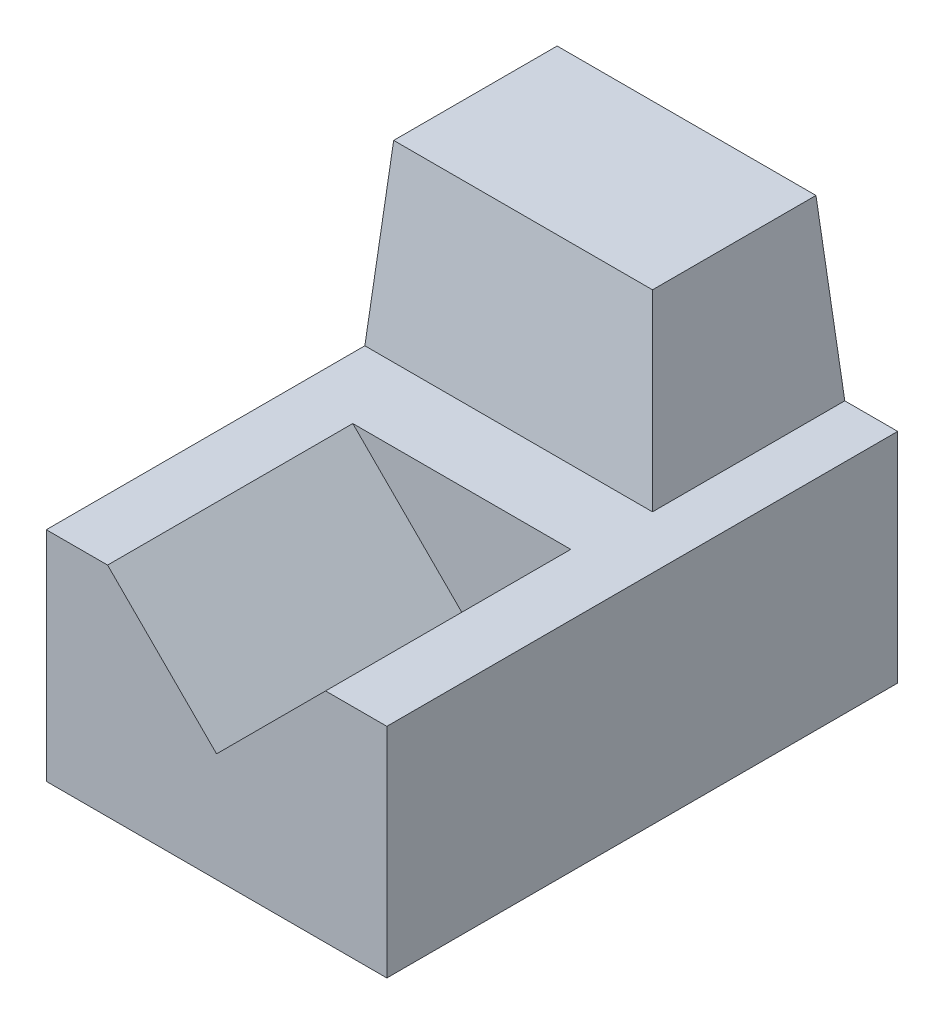
ISO-10303-21;
HEADER;
FILE_DESCRIPTION(('STEP AP214'),'2;1');
FILE_NAME('part.step','',(''),(''),'','','');
FILE_SCHEMA(('AUTOMOTIVE_DESIGN { 1 0 10303 214 1 1 1 1 }'));
ENDSEC;
DATA;
#1=APPLICATION_CONTEXT('core data for automotive mechanical design processes');
#2=APPLICATION_PROTOCOL_DEFINITION('international standard','automotive_design',2000,#1);
#3=PRODUCT_CONTEXT('',#1,'mechanical');
#4=PRODUCT('Part','Part','',(#3));
#5=PRODUCT_RELATED_PRODUCT_CATEGORY('part','',(#4));
#6=PRODUCT_DEFINITION_FORMATION('','',#4);
#7=PRODUCT_DEFINITION_CONTEXT('part definition',#1,'design');
#8=PRODUCT_DEFINITION('design','',#6,#7);
#9=PRODUCT_DEFINITION_SHAPE('','',#8);
#10=(LENGTH_UNIT() NAMED_UNIT(*) SI_UNIT(.MILLI.,.METRE.));
#11=(NAMED_UNIT(*) PLANE_ANGLE_UNIT() SI_UNIT($,.RADIAN.));
#12=(NAMED_UNIT(*) SI_UNIT($,.STERADIAN.) SOLID_ANGLE_UNIT());
#13=UNCERTAINTY_MEASURE_WITH_UNIT(LENGTH_MEASURE(1.E-05),#10,'distance_accuracy_value','');
#14=(GEOMETRIC_REPRESENTATION_CONTEXT(3) GLOBAL_UNCERTAINTY_ASSIGNED_CONTEXT((#13)) GLOBAL_UNIT_ASSIGNED_CONTEXT((#10,
#11,#12)) REPRESENTATION_CONTEXT('',''));
#15=CARTESIAN_POINT('',(0.,0.,0.));
#16=DIRECTION('',(0.,0.,1.));
#17=DIRECTION('',(1.,0.,0.));
#18=AXIS2_PLACEMENT_3D('',#15,#16,#17);
#19=CARTESIAN_POINT('',(25.,16.,-37.5));
#20=DIRECTION('',(-1.,0.,0.));
#21=DIRECTION('',(0.,0.,1.));
#22=AXIS2_PLACEMENT_3D('',#19,#20,#21);
#23=PLANE('',#22);
#24=DIRECTION('',(0.,0.,-1.));
#25=VECTOR('',#24,1.);
#26=CARTESIAN_POINT('',(25.,-16.,-37.5));
#27=LINE('',#26,#25);
#28=CARTESIAN_POINT('',(25.,-16.,37.5));
#29=VERTEX_POINT('',#28);
#30=CARTESIAN_POINT('',(25.,-16.,-37.5));
#31=VERTEX_POINT('',#30);
#32=EDGE_CURVE('E157',#29,#31,#27,.T.);
#33=ORIENTED_EDGE('',*,*,#32,.T.);
#34=DIRECTION('',(0.,-1.,0.));
#35=VECTOR('',#34,1.);
#36=CARTESIAN_POINT('',(25.,16.,-37.5));
#37=LINE('',#36,#35);
#38=CARTESIAN_POINT('',(25.,16.,-37.5));
#39=VERTEX_POINT('',#38);
#40=EDGE_CURVE('E11',#39,#31,#37,.T.);
#41=ORIENTED_EDGE('',*,*,#40,.F.);
#42=DIRECTION('',(0.,0.,-1.));
#43=VECTOR('',#42,1.);
#44=CARTESIAN_POINT('',(25.,16.,-37.5));
#45=LINE('',#44,#43);
#46=CARTESIAN_POINT('',(25.,16.,37.5));
#47=VERTEX_POINT('',#46);
#48=EDGE_CURVE('E162',#47,#39,#45,.T.);
#49=ORIENTED_EDGE('',*,*,#48,.F.);
#50=DIRECTION('',(0.,-1.,0.));
#51=VECTOR('',#50,1.);
#52=CARTESIAN_POINT('',(25.,16.,37.5));
#53=LINE('',#52,#51);
#54=EDGE_CURVE('E174',#47,#29,#53,.T.);
#55=ORIENTED_EDGE('',*,*,#54,.T.);
#56=EDGE_LOOP('',(#33,#41,#49,#55));
#57=FACE_BOUND('',#56,.T.);
#58=ADVANCED_FACE('F37',(#57),#23,.F.);
#59=CARTESIAN_POINT('',(-25.,16.,-37.5));
#60=DIRECTION('',(0.,0.,1.));
#61=DIRECTION('',(1.,0.,0.));
#62=AXIS2_PLACEMENT_3D('',#59,#60,#61);
#63=PLANE('',#62);
#64=DIRECTION('',(-1.,0.,0.));
#65=VECTOR('',#64,1.);
#66=CARTESIAN_POINT('',(-25.,-16.,-37.5));
#67=LINE('',#66,#65);
#68=CARTESIAN_POINT('',(-25.,-16.,-37.5));
#69=VERTEX_POINT('',#68);
#70=EDGE_CURVE('E117',#31,#69,#67,.T.);
#71=ORIENTED_EDGE('',*,*,#70,.T.);
#72=DIRECTION('',(0.,-1.,0.));
#73=VECTOR('',#72,1.);
#74=CARTESIAN_POINT('',(-25.,16.,-37.5));
#75=LINE('',#74,#73);
#76=CARTESIAN_POINT('',(-25.,40.,-37.5));
#77=VERTEX_POINT('',#76);
#78=EDGE_CURVE('E47',#77,#69,#75,.T.);
#79=ORIENTED_EDGE('',*,*,#78,.F.);
#80=DIRECTION('',(-1.,0.,0.));
#81=VECTOR('',#80,1.);
#82=CARTESIAN_POINT('',(-25.,40.,-37.5));
#83=LINE('',#82,#81);
#84=CARTESIAN_POINT('',(13.,40.,-37.5));
#85=VERTEX_POINT('',#84);
#86=EDGE_CURVE('E116',#85,#77,#83,.T.);
#87=ORIENTED_EDGE('',*,*,#86,.F.);
#88=DIRECTION('',(-0.173648177666931,0.984807753012208,0.));
#89=VECTOR('',#88,1.);
#90=CARTESIAN_POINT('',(15.9584015148403,23.2220712737568,-37.5));
#91=LINE('',#90,#89);
#92=CARTESIAN_POINT('',(17.2318475370032,16.,-37.5));
#93=VERTEX_POINT('',#92);
#94=EDGE_CURVE('E41',#85,#93,#91,.F.);
#95=ORIENTED_EDGE('',*,*,#94,.T.);
#96=DIRECTION('',(-1.,0.,0.));
#97=VECTOR('',#96,1.);
#98=CARTESIAN_POINT('',(-25.,16.,-37.5));
#99=LINE('',#98,#97);
#100=EDGE_CURVE('E165',#39,#93,#99,.T.);
#101=ORIENTED_EDGE('',*,*,#100,.F.);
#102=ORIENTED_EDGE('',*,*,#40,.T.);
#103=EDGE_LOOP('',(#71,#79,#87,#95,#101,#102));
#104=FACE_BOUND('',#103,.T.);
#105=ADVANCED_FACE('F113',(#104),#63,.F.);
#106=CARTESIAN_POINT('',(-25.,16.,-37.5));
#107=DIRECTION('',(1.,0.,0.));
#108=DIRECTION('',(0.,0.,-1.));
#109=AXIS2_PLACEMENT_3D('',#106,#107,#108);
#110=PLANE('',#109);
#111=DIRECTION('',(0.,0.,1.));
#112=VECTOR('',#111,1.);
#113=CARTESIAN_POINT('',(-25.,-16.,-37.5));
#114=LINE('',#113,#112);
#115=CARTESIAN_POINT('',(-25.,-16.,37.5));
#116=VERTEX_POINT('',#115);
#117=EDGE_CURVE('E178',#69,#116,#114,.T.);
#118=ORIENTED_EDGE('',*,*,#117,.T.);
#119=DIRECTION('',(0.,-1.,0.));
#120=VECTOR('',#119,1.);
#121=CARTESIAN_POINT('',(-25.,16.,37.5));
#122=LINE('',#121,#120);
#123=CARTESIAN_POINT('',(-25.,16.,37.5));
#124=VERTEX_POINT('',#123);
#125=EDGE_CURVE('E120',#124,#116,#122,.T.);
#126=ORIENTED_EDGE('',*,*,#125,.F.);
#127=DIRECTION('',(0.,0.,1.));
#128=VECTOR('',#127,1.);
#129=CARTESIAN_POINT('',(-25.,16.,-37.5));
#130=LINE('',#129,#128);
#131=CARTESIAN_POINT('',(-25.,16.,-9.26815246299683));
#132=VERTEX_POINT('',#131);
#133=EDGE_CURVE('E168',#132,#124,#130,.T.);
#134=ORIENTED_EDGE('',*,*,#133,.F.);
#135=DIRECTION('',(0.,0.984807753012208,-0.173648177666931));
#136=VECTOR('',#135,1.);
#137=CARTESIAN_POINT('',(-25.,40.,-13.5));
#138=LINE('',#137,#136);
#139=CARTESIAN_POINT('',(-25.,40.,-13.5));
#140=VERTEX_POINT('',#139);
#141=EDGE_CURVE('E126',#140,#132,#138,.F.);
#142=ORIENTED_EDGE('',*,*,#141,.F.);
#143=DIRECTION('',(0.,0.,1.));
#144=VECTOR('',#143,1.);
#145=CARTESIAN_POINT('',(-25.,40.,-13.5));
#146=LINE('',#145,#144);
#147=EDGE_CURVE('E123',#77,#140,#146,.T.);
#148=ORIENTED_EDGE('',*,*,#147,.F.);
#149=ORIENTED_EDGE('',*,*,#78,.T.);
#150=EDGE_LOOP('',(#118,#126,#134,#142,#148,#149));
#151=FACE_BOUND('',#150,.T.);
#152=ADVANCED_FACE('F124',(#151),#110,.F.);
#153=CARTESIAN_POINT('',(-25.,16.,37.5));
#154=DIRECTION('',(0.,0.,-1.));
#155=DIRECTION('',(-1.,0.,0.));
#156=AXIS2_PLACEMENT_3D('',#153,#154,#155);
#157=PLANE('',#156);
#158=DIRECTION('',(1.,0.,0.));
#159=VECTOR('',#158,1.);
#160=CARTESIAN_POINT('',(-25.,16.,37.5));
#161=LINE('',#160,#159);
#162=CARTESIAN_POINT('',(16.,16.,37.5));
#163=VERTEX_POINT('',#162);
#164=EDGE_CURVE('E170',#163,#47,#161,.T.);
#165=ORIENTED_EDGE('',*,*,#164,.F.);
#166=DIRECTION('',(0.707106781186548,0.707106781186547,0.));
#167=VECTOR('',#166,1.);
#168=CARTESIAN_POINT('',(16.,16.,37.5));
#169=LINE('',#168,#167);
#170=CARTESIAN_POINT('',(0.,0.,37.5));
#171=VERTEX_POINT('',#170);
#172=EDGE_CURVE('E151',#171,#163,#169,.T.);
#173=ORIENTED_EDGE('',*,*,#172,.F.);
#174=DIRECTION('',(0.707106781186547,-0.707106781186548,0.));
#175=VECTOR('',#174,1.);
#176=CARTESIAN_POINT('',(0.,0.,37.5));
#177=LINE('',#176,#175);
#178=CARTESIAN_POINT('',(-16.,16.,37.5));
#179=VERTEX_POINT('',#178);
#180=EDGE_CURVE('E145',#179,#171,#177,.T.);
#181=ORIENTED_EDGE('',*,*,#180,.F.);
#182=EDGE_CURVE('E171',#124,#179,#161,.T.);
#183=ORIENTED_EDGE('',*,*,#182,.F.);
#184=ORIENTED_EDGE('',*,*,#125,.T.);
#185=DIRECTION('',(1.,0.,0.));
#186=VECTOR('',#185,1.);
#187=CARTESIAN_POINT('',(-25.,-16.,37.5));
#188=LINE('',#187,#186);
#189=EDGE_CURVE('E166',#116,#29,#188,.T.);
#190=ORIENTED_EDGE('',*,*,#189,.T.);
#191=ORIENTED_EDGE('',*,*,#54,.F.);
#192=EDGE_LOOP('',(#165,#173,#181,#183,#184,#190,#191));
#193=FACE_BOUND('',#192,.T.);
#194=ADVANCED_FACE('F205',(#193),#157,.F.);
#195=CARTESIAN_POINT('',(0.,16.,0.));
#196=DIRECTION('',(0.,1.,0.));
#197=DIRECTION('',(0.,0.,1.));
#198=AXIS2_PLACEMENT_3D('',#195,#196,#197);
#199=PLANE('',#198);
#200=DIRECTION('',(0.,0.,1.));
#201=VECTOR('',#200,1.);
#202=CARTESIAN_POINT('',(17.2318475370032,16.,-37.5));
#203=LINE('',#202,#201);
#204=CARTESIAN_POINT('',(17.2318475370032,16.,-9.26815246299684));
#205=VERTEX_POINT('',#204);
#206=EDGE_CURVE('E135',#205,#93,#203,.F.);
#207=ORIENTED_EDGE('',*,*,#206,.F.);
#208=DIRECTION('',(-1.,0.,0.));
#209=VECTOR('',#208,1.);
#210=CARTESIAN_POINT('',(13.,16.,-9.26815246299683));
#211=LINE('',#210,#209);
#212=EDGE_CURVE('E54',#132,#205,#211,.F.);
#213=ORIENTED_EDGE('',*,*,#212,.F.);
#214=ORIENTED_EDGE('',*,*,#133,.T.);
#215=ORIENTED_EDGE('',*,*,#182,.T.);
#216=DIRECTION('',(0.,0.,1.));
#217=VECTOR('',#216,1.);
#218=CARTESIAN_POINT('',(-16.,16.,1.49999999999999));
#219=LINE('',#218,#217);
#220=CARTESIAN_POINT('',(-16.,16.,1.49999999999999));
#221=VERTEX_POINT('',#220);
#222=EDGE_CURVE('E158',#221,#179,#219,.T.);
#223=ORIENTED_EDGE('',*,*,#222,.F.);
#224=DIRECTION('',(-1.,0.,0.));
#225=VECTOR('',#224,1.);
#226=CARTESIAN_POINT('',(-16.,16.,1.49999999999999));
#227=LINE('',#226,#225);
#228=CARTESIAN_POINT('',(16.,16.,1.49999999999999));
#229=VERTEX_POINT('',#228);
#230=EDGE_CURVE('E144',#229,#221,#227,.T.);
#231=ORIENTED_EDGE('',*,*,#230,.F.);
#232=DIRECTION('',(0.,0.,1.));
#233=VECTOR('',#232,1.);
#234=CARTESIAN_POINT('',(16.,16.,1.49999999999999));
#235=LINE('',#234,#233);
#236=EDGE_CURVE('E150',#229,#163,#235,.T.);
#237=ORIENTED_EDGE('',*,*,#236,.T.);
#238=ORIENTED_EDGE('',*,*,#164,.T.);
#239=ORIENTED_EDGE('',*,*,#48,.T.);
#240=ORIENTED_EDGE('',*,*,#100,.T.);
#241=EDGE_LOOP('',(#207,#213,#214,#215,#223,#231,#237,#238,#239,#240));
#242=FACE_BOUND('',#241,.T.);
#243=ADVANCED_FACE('F194',(#242),#199,.T.);
#244=CARTESIAN_POINT('',(0.,-16.,0.));
#245=DIRECTION('',(0.,1.,0.));
#246=DIRECTION('',(0.,0.,1.));
#247=AXIS2_PLACEMENT_3D('',#244,#245,#246);
#248=PLANE('',#247);
#249=ORIENTED_EDGE('',*,*,#32,.F.);
#250=ORIENTED_EDGE('',*,*,#189,.F.);
#251=ORIENTED_EDGE('',*,*,#117,.F.);
#252=ORIENTED_EDGE('',*,*,#70,.F.);
#253=EDGE_LOOP('',(#249,#250,#251,#252));
#254=FACE_BOUND('',#253,.T.);
#255=ADVANCED_FACE('F201',(#254),#248,.F.);
#256=CARTESIAN_POINT('',(16.,16.,1.49999999999999));
#257=DIRECTION('',(0.707106781186547,-0.707106781186548,0.));
#258=DIRECTION('',(0.707106781186548,0.707106781186547,0.));
#259=AXIS2_PLACEMENT_3D('',#256,#257,#258);
#260=PLANE('',#259);
#261=ORIENTED_EDGE('',*,*,#172,.T.);
#262=ORIENTED_EDGE('',*,*,#236,.F.);
#263=DIRECTION('',(0.707106781186548,0.707106781186547,0.));
#264=VECTOR('',#263,1.);
#265=CARTESIAN_POINT('',(16.,16.,1.49999999999999));
#266=LINE('',#265,#264);
#267=CARTESIAN_POINT('',(0.,0.,1.49999999999999));
#268=VERTEX_POINT('',#267);
#269=EDGE_CURVE('E142',#268,#229,#266,.T.);
#270=ORIENTED_EDGE('',*,*,#269,.F.);
#271=DIRECTION('',(0.,0.,1.));
#272=VECTOR('',#271,1.);
#273=CARTESIAN_POINT('',(0.,0.,1.49999999999999));
#274=LINE('',#273,#272);
#275=EDGE_CURVE('E155',#268,#171,#274,.T.);
#276=ORIENTED_EDGE('',*,*,#275,.T.);
#277=EDGE_LOOP('',(#261,#262,#270,#276));
#278=FACE_BOUND('',#277,.T.);
#279=ADVANCED_FACE('F218',(#278),#260,.F.);
#280=CARTESIAN_POINT('',(0.,0.,1.49999999999999));
#281=DIRECTION('',(-0.707106781186548,-0.707106781186547,0.));
#282=DIRECTION('',(0.707106781186547,-0.707106781186548,0.));
#283=AXIS2_PLACEMENT_3D('',#280,#281,#282);
#284=PLANE('',#283);
#285=ORIENTED_EDGE('',*,*,#180,.T.);
#286=ORIENTED_EDGE('',*,*,#275,.F.);
#287=DIRECTION('',(0.707106781186547,-0.707106781186548,0.));
#288=VECTOR('',#287,1.);
#289=CARTESIAN_POINT('',(0.,0.,1.49999999999999));
#290=LINE('',#289,#288);
#291=EDGE_CURVE('E147',#221,#268,#290,.T.);
#292=ORIENTED_EDGE('',*,*,#291,.F.);
#293=ORIENTED_EDGE('',*,*,#222,.T.);
#294=EDGE_LOOP('',(#285,#286,#292,#293));
#295=FACE_BOUND('',#294,.T.);
#296=ADVANCED_FACE('F212',(#295),#284,.F.);
#297=CARTESIAN_POINT('',(0.,0.,1.49999999999999));
#298=DIRECTION('',(0.,0.,-1.));
#299=DIRECTION('',(-1.,0.,0.));
#300=AXIS2_PLACEMENT_3D('',#297,#298,#299);
#301=PLANE('',#300);
#302=ORIENTED_EDGE('',*,*,#269,.T.);
#303=ORIENTED_EDGE('',*,*,#230,.T.);
#304=ORIENTED_EDGE('',*,*,#291,.T.);
#305=EDGE_LOOP('',(#302,#303,#304));
#306=FACE_BOUND('',#305,.T.);
#307=ADVANCED_FACE('F215',(#306),#301,.F.);
#308=CARTESIAN_POINT('',(13.,40.,-13.5));
#309=DIRECTION('',(0.,0.173648177666931,0.984807753012208));
#310=DIRECTION('',(0.,-0.984807753012208,0.173648177666931));
#311=AXIS2_PLACEMENT_3D('',#308,#309,#310);
#312=PLANE('',#311);
#313=ORIENTED_EDGE('',*,*,#212,.T.);
#314=DIRECTION('',(0.171087869746036,-0.970287525247814,0.171087869746036));
#315=VECTOR('',#314,1.);
#316=CARTESIAN_POINT('',(12.2974945798183,43.9841062176592,-14.2025054201817));
#317=LINE('',#316,#315);
#318=CARTESIAN_POINT('',(13.,40.,-13.5));
#319=VERTEX_POINT('',#318);
#320=EDGE_CURVE('E185',#319,#205,#317,.T.);
#321=ORIENTED_EDGE('',*,*,#320,.F.);
#322=DIRECTION('',(1.,0.,0.));
#323=VECTOR('',#322,1.);
#324=CARTESIAN_POINT('',(13.,40.,-13.5));
#325=LINE('',#324,#323);
#326=EDGE_CURVE('E129',#140,#319,#325,.T.);
#327=ORIENTED_EDGE('',*,*,#326,.F.);
#328=ORIENTED_EDGE('',*,*,#141,.T.);
#329=EDGE_LOOP('',(#313,#321,#327,#328));
#330=FACE_BOUND('',#329,.T.);
#331=ADVANCED_FACE('F39',(#330),#312,.T.);
#332=CARTESIAN_POINT('',(13.,40.,-37.5));
#333=DIRECTION('',(0.984807753012208,0.173648177666931,0.));
#334=DIRECTION('',(-0.173648177666931,0.984807753012208,0.));
#335=AXIS2_PLACEMENT_3D('',#332,#333,#334);
#336=PLANE('',#335);
#337=ORIENTED_EDGE('',*,*,#206,.T.);
#338=ORIENTED_EDGE('',*,*,#94,.F.);
#339=DIRECTION('',(0.,0.,-1.));
#340=VECTOR('',#339,1.);
#341=CARTESIAN_POINT('',(13.,40.,-37.5));
#342=LINE('',#341,#340);
#343=EDGE_CURVE('E133',#319,#85,#342,.T.);
#344=ORIENTED_EDGE('',*,*,#343,.F.);
#345=ORIENTED_EDGE('',*,*,#320,.T.);
#346=EDGE_LOOP('',(#337,#338,#344,#345));
#347=FACE_BOUND('',#346,.T.);
#348=ADVANCED_FACE('F191',(#347),#336,.T.);
#349=CARTESIAN_POINT('',(0.,40.,0.));
#350=DIRECTION('',(0.,-1.,0.));
#351=DIRECTION('',(0.,0.,-1.));
#352=AXIS2_PLACEMENT_3D('',#349,#350,#351);
#353=PLANE('',#352);
#354=ORIENTED_EDGE('',*,*,#86,.T.);
#355=ORIENTED_EDGE('',*,*,#147,.T.);
#356=ORIENTED_EDGE('',*,*,#326,.T.);
#357=ORIENTED_EDGE('',*,*,#343,.T.);
#358=EDGE_LOOP('',(#354,#355,#356,#357));
#359=FACE_BOUND('',#358,.T.);
#360=ADVANCED_FACE('F131',(#359),#353,.F.);
#361=CLOSED_SHELL('',(#58,#105,#152,#194,#243,#255,#279,#296,#307,#331,#348,#360));
#362=MANIFOLD_SOLID_BREP('B2',#361);
#363=ADVANCED_BREP_SHAPE_REPRESENTATION('',(#18,#362),#14);
#364=SHAPE_DEFINITION_REPRESENTATION(#9,#363);
ENDSEC;
END-ISO-10303-21;
